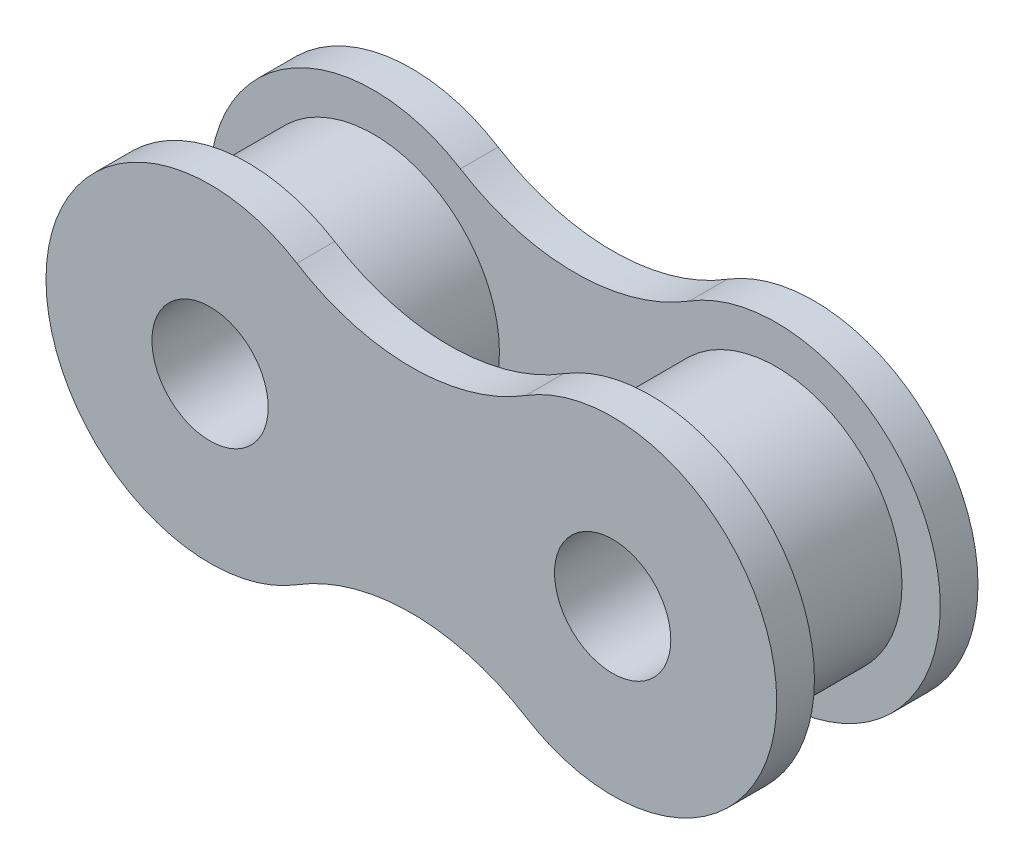
ISO-10303-21;
HEADER;
FILE_DESCRIPTION(('STEP AP214'),'2;1');
FILE_NAME('part.step','',(''),(''),'','','');
FILE_SCHEMA(('AUTOMOTIVE_DESIGN { 1 0 10303 214 1 1 1 1 }'));
ENDSEC;
DATA;
#1=APPLICATION_CONTEXT('core data for automotive mechanical design processes');
#2=APPLICATION_PROTOCOL_DEFINITION('international standard','automotive_design',2000,#1);
#3=PRODUCT_CONTEXT('',#1,'mechanical');
#4=PRODUCT('Part','Part','',(#3));
#5=PRODUCT_RELATED_PRODUCT_CATEGORY('part','',(#4));
#6=PRODUCT_DEFINITION_FORMATION('','',#4);
#7=PRODUCT_DEFINITION_CONTEXT('part definition',#1,'design');
#8=PRODUCT_DEFINITION('design','',#6,#7);
#9=PRODUCT_DEFINITION_SHAPE('','',#8);
#10=(LENGTH_UNIT() NAMED_UNIT(*) SI_UNIT(.MILLI.,.METRE.));
#11=(NAMED_UNIT(*) PLANE_ANGLE_UNIT() SI_UNIT($,.RADIAN.));
#12=(NAMED_UNIT(*) SI_UNIT($,.STERADIAN.) SOLID_ANGLE_UNIT());
#13=UNCERTAINTY_MEASURE_WITH_UNIT(LENGTH_MEASURE(1.E-05),#10,'distance_accuracy_value','');
#14=(GEOMETRIC_REPRESENTATION_CONTEXT(3) GLOBAL_UNCERTAINTY_ASSIGNED_CONTEXT((#13)) GLOBAL_UNIT_ASSIGNED_CONTEXT((#10,
#11,#12)) REPRESENTATION_CONTEXT('',''));
#15=CARTESIAN_POINT('',(0.,0.,0.));
#16=DIRECTION('',(0.,0.,1.));
#17=DIRECTION('',(1.,0.,0.));
#18=AXIS2_PLACEMENT_3D('',#15,#16,#17);
#19=CARTESIAN_POINT('',(-2.,-3.20755358489925,-4.));
#20=DIRECTION('',(0.,0.,1.));
#21=DIRECTION('',(1.,0.,0.));
#22=AXIS2_PLACEMENT_3D('',#19,#20,#21);
#23=PLANE('',#22);
#24=CARTESIAN_POINT('',(-4.,0.,-4.));
#25=DIRECTION('',(0.,0.,1.));
#26=DIRECTION('',(1.,0.,0.));
#27=AXIS2_PLACEMENT_3D('',#24,#25,#26);
#28=CIRCLE('',#27,3.26);
#29=CARTESIAN_POINT('',(-2.27513227513228,2.76630282718824,-4.));
#30=VERTEX_POINT('',#29);
#31=CARTESIAN_POINT('',(-2.27513227513227,-2.76630282718824,-4.));
#32=VERTEX_POINT('',#31);
#33=EDGE_CURVE('E173',#30,#32,#28,.T.);
#34=ORIENTED_EDGE('',*,*,#33,.T.);
#35=CARTESIAN_POINT('',(0.,-6.41510716979849,-4.));
#36=DIRECTION('',(0.,0.,-1.));
#37=DIRECTION('',(1.,0.,0.));
#38=AXIS2_PLACEMENT_3D('',#35,#36,#37);
#39=CIRCLE('',#38,4.3);
#40=CARTESIAN_POINT('',(2.27513227513228,-2.76630282718824,-4.));
#41=VERTEX_POINT('',#40);
#42=EDGE_CURVE('E85',#32,#41,#39,.T.);
#43=ORIENTED_EDGE('',*,*,#42,.T.);
#44=CARTESIAN_POINT('',(4.,0.,-4.));
#45=DIRECTION('',(0.,0.,1.));
#46=DIRECTION('',(1.,0.,0.));
#47=AXIS2_PLACEMENT_3D('',#44,#45,#46);
#48=CIRCLE('',#47,3.26);
#49=CARTESIAN_POINT('',(2.27513227513228,2.76630282718824,-4.));
#50=VERTEX_POINT('',#49);
#51=EDGE_CURVE('E176',#41,#50,#48,.T.);
#52=ORIENTED_EDGE('',*,*,#51,.T.);
#53=CARTESIAN_POINT('',(0.,6.41510716979849,-4.));
#54=DIRECTION('',(0.,0.,-1.));
#55=DIRECTION('',(1.,0.,0.));
#56=AXIS2_PLACEMENT_3D('',#53,#54,#55);
#57=CIRCLE('',#56,4.3);
#58=EDGE_CURVE('E53',#50,#30,#57,.T.);
#59=ORIENTED_EDGE('',*,*,#58,.T.);
#60=EDGE_LOOP('',(#34,#43,#52,#59));
#61=FACE_BOUND('',#60,.T.);
#62=CARTESIAN_POINT('',(-4.,0.,-4.));
#63=DIRECTION('',(0.,0.,1.));
#64=DIRECTION('',(1.,0.,0.));
#65=AXIS2_PLACEMENT_3D('',#62,#63,#64);
#66=CIRCLE('',#65,2.5);
#67=CARTESIAN_POINT('',(-6.5,0.,-4.));
#68=VERTEX_POINT('',#67);
#69=EDGE_CURVE('E11',#68,#68,#66,.T.);
#70=ORIENTED_EDGE('',*,*,#69,.F.);
#71=EDGE_LOOP('',(#70));
#72=FACE_BOUND('',#71,.T.);
#73=CARTESIAN_POINT('',(4.,0.,-4.));
#74=DIRECTION('',(0.,0.,1.));
#75=DIRECTION('',(1.,0.,0.));
#76=AXIS2_PLACEMENT_3D('',#73,#74,#75);
#77=CIRCLE('',#76,2.5);
#78=CARTESIAN_POINT('',(1.5,0.,-4.));
#79=VERTEX_POINT('',#78);
#80=EDGE_CURVE('E157',#79,#79,#77,.T.);
#81=ORIENTED_EDGE('',*,*,#80,.F.);
#82=EDGE_LOOP('',(#81));
#83=FACE_BOUND('',#82,.T.);
#84=ADVANCED_FACE('F34',(#61,#72,#83),#23,.T.);
#85=CARTESIAN_POINT('',(-2.,-3.20755358489925,-4.75));
#86=DIRECTION('',(0.,0.,1.));
#87=DIRECTION('',(1.,0.,0.));
#88=AXIS2_PLACEMENT_3D('',#85,#86,#87);
#89=PLANE('',#88);
#90=CARTESIAN_POINT('',(-4.,0.,-4.75));
#91=DIRECTION('',(0.,0.,1.));
#92=DIRECTION('',(1.,0.,0.));
#93=AXIS2_PLACEMENT_3D('',#90,#91,#92);
#94=CIRCLE('',#93,3.26);
#95=CARTESIAN_POINT('',(-2.27513227513228,2.76630282718824,-4.75));
#96=VERTEX_POINT('',#95);
#97=CARTESIAN_POINT('',(-2.27513227513227,-2.76630282718824,-4.75));
#98=VERTEX_POINT('',#97);
#99=EDGE_CURVE('E172',#96,#98,#94,.T.);
#100=ORIENTED_EDGE('',*,*,#99,.F.);
#101=CARTESIAN_POINT('',(0.,6.41510716979849,-4.75));
#102=DIRECTION('',(0.,0.,-1.));
#103=DIRECTION('',(1.,0.,0.));
#104=AXIS2_PLACEMENT_3D('',#101,#102,#103);
#105=CIRCLE('',#104,4.3);
#106=CARTESIAN_POINT('',(2.27513227513228,2.76630282718824,-4.75));
#107=VERTEX_POINT('',#106);
#108=EDGE_CURVE('E77',#107,#96,#105,.T.);
#109=ORIENTED_EDGE('',*,*,#108,.F.);
#110=CARTESIAN_POINT('',(4.,0.,-4.75));
#111=DIRECTION('',(0.,0.,1.));
#112=DIRECTION('',(1.,0.,0.));
#113=AXIS2_PLACEMENT_3D('',#110,#111,#112);
#114=CIRCLE('',#113,3.26);
#115=CARTESIAN_POINT('',(2.27513227513228,-2.76630282718824,-4.75));
#116=VERTEX_POINT('',#115);
#117=EDGE_CURVE('E71',#116,#107,#114,.T.);
#118=ORIENTED_EDGE('',*,*,#117,.F.);
#119=CARTESIAN_POINT('',(0.,-6.41510716979849,-4.75));
#120=DIRECTION('',(0.,0.,-1.));
#121=DIRECTION('',(1.,0.,0.));
#122=AXIS2_PLACEMENT_3D('',#119,#120,#121);
#123=CIRCLE('',#122,4.3);
#124=EDGE_CURVE('E182',#98,#116,#123,.T.);
#125=ORIENTED_EDGE('',*,*,#124,.F.);
#126=EDGE_LOOP('',(#100,#109,#118,#125));
#127=FACE_BOUND('',#126,.T.);
#128=CARTESIAN_POINT('',(-4.,0.,-4.75));
#129=DIRECTION('',(0.,0.,1.));
#130=DIRECTION('',(1.,0.,0.));
#131=AXIS2_PLACEMENT_3D('',#128,#129,#130);
#132=CIRCLE('',#131,1.155);
#133=CARTESIAN_POINT('',(-2.845,0.,-4.75));
#134=VERTEX_POINT('',#133);
#135=EDGE_CURVE('E169',#134,#134,#132,.T.);
#136=ORIENTED_EDGE('',*,*,#135,.T.);
#137=EDGE_LOOP('',(#136));
#138=FACE_BOUND('',#137,.T.);
#139=CARTESIAN_POINT('',(4.,0.,-4.75));
#140=DIRECTION('',(0.,0.,1.));
#141=DIRECTION('',(1.,0.,0.));
#142=AXIS2_PLACEMENT_3D('',#139,#140,#141);
#143=CIRCLE('',#142,1.155);
#144=CARTESIAN_POINT('',(5.155,0.,-4.75));
#145=VERTEX_POINT('',#144);
#146=EDGE_CURVE('E165',#145,#145,#143,.T.);
#147=ORIENTED_EDGE('',*,*,#146,.T.);
#148=EDGE_LOOP('',(#147));
#149=FACE_BOUND('',#148,.T.);
#150=ADVANCED_FACE('F196',(#127,#138,#149),#89,.F.);
#151=CARTESIAN_POINT('',(-4.,0.,-4.));
#152=DIRECTION('',(0.,0.,-1.));
#153=DIRECTION('',(-1.,0.,0.));
#154=AXIS2_PLACEMENT_3D('',#151,#152,#153);
#155=CYLINDRICAL_SURFACE('',#154,3.26);
#156=ORIENTED_EDGE('',*,*,#99,.T.);
#157=DIRECTION('',(0.,0.,-1.));
#158=VECTOR('',#157,1.);
#159=CARTESIAN_POINT('',(-2.27513227513227,-2.76630282718824,-4.));
#160=LINE('',#159,#158);
#161=EDGE_CURVE('E44',#32,#98,#160,.T.);
#162=ORIENTED_EDGE('',*,*,#161,.F.);
#163=ORIENTED_EDGE('',*,*,#33,.F.);
#164=DIRECTION('',(0.,0.,-1.));
#165=VECTOR('',#164,1.);
#166=CARTESIAN_POINT('',(-2.27513227513228,2.76630282718824,-4.));
#167=LINE('',#166,#165);
#168=EDGE_CURVE('E179',#30,#96,#167,.T.);
#169=ORIENTED_EDGE('',*,*,#168,.T.);
#170=EDGE_LOOP('',(#156,#162,#163,#169));
#171=FACE_BOUND('',#170,.T.);
#172=ADVANCED_FACE('F36',(#171),#155,.T.);
#173=CARTESIAN_POINT('',(0.,-6.41510716979849,-4.));
#174=DIRECTION('',(0.,0.,-1.));
#175=DIRECTION('',(-1.,0.,0.));
#176=AXIS2_PLACEMENT_3D('',#173,#174,#175);
#177=CYLINDRICAL_SURFACE('',#176,4.3);
#178=ORIENTED_EDGE('',*,*,#124,.T.);
#179=DIRECTION('',(0.,0.,-1.));
#180=VECTOR('',#179,1.);
#181=CARTESIAN_POINT('',(2.27513227513228,-2.76630282718824,-4.));
#182=LINE('',#181,#180);
#183=EDGE_CURVE('E189',#41,#116,#182,.T.);
#184=ORIENTED_EDGE('',*,*,#183,.F.);
#185=ORIENTED_EDGE('',*,*,#42,.F.);
#186=ORIENTED_EDGE('',*,*,#161,.T.);
#187=EDGE_LOOP('',(#178,#184,#185,#186));
#188=FACE_BOUND('',#187,.T.);
#189=ADVANCED_FACE('F191',(#188),#177,.F.);
#190=CARTESIAN_POINT('',(4.,0.,-4.));
#191=DIRECTION('',(0.,0.,-1.));
#192=DIRECTION('',(-1.,0.,0.));
#193=AXIS2_PLACEMENT_3D('',#190,#191,#192);
#194=CYLINDRICAL_SURFACE('',#193,3.26);
#195=ORIENTED_EDGE('',*,*,#117,.T.);
#196=DIRECTION('',(0.,0.,-1.));
#197=VECTOR('',#196,1.);
#198=CARTESIAN_POINT('',(2.27513227513228,2.76630282718824,-4.));
#199=LINE('',#198,#197);
#200=EDGE_CURVE('E187',#50,#107,#199,.T.);
#201=ORIENTED_EDGE('',*,*,#200,.F.);
#202=ORIENTED_EDGE('',*,*,#51,.F.);
#203=ORIENTED_EDGE('',*,*,#183,.T.);
#204=EDGE_LOOP('',(#195,#201,#202,#203));
#205=FACE_BOUND('',#204,.T.);
#206=ADVANCED_FACE('F242',(#205),#194,.T.);
#207=CARTESIAN_POINT('',(0.,6.41510716979849,-4.));
#208=DIRECTION('',(0.,0.,-1.));
#209=DIRECTION('',(-1.,0.,0.));
#210=AXIS2_PLACEMENT_3D('',#207,#208,#209);
#211=CYLINDRICAL_SURFACE('',#210,4.3);
#212=ORIENTED_EDGE('',*,*,#108,.T.);
#213=ORIENTED_EDGE('',*,*,#168,.F.);
#214=ORIENTED_EDGE('',*,*,#58,.F.);
#215=ORIENTED_EDGE('',*,*,#200,.T.);
#216=EDGE_LOOP('',(#212,#213,#214,#215));
#217=FACE_BOUND('',#216,.T.);
#218=ADVANCED_FACE('F239',(#217),#211,.F.);
#219=CARTESIAN_POINT('',(-4.,0.,-4.));
#220=DIRECTION('',(0.,0.,-1.));
#221=DIRECTION('',(-1.,0.,0.));
#222=AXIS2_PLACEMENT_3D('',#219,#220,#221);
#223=CYLINDRICAL_SURFACE('',#222,1.155);
#224=ORIENTED_EDGE('',*,*,#135,.F.);
#225=EDGE_LOOP('',(#224));
#226=FACE_BOUND('',#225,.T.);
#227=CARTESIAN_POINT('',(-4.,0.,-0.75));
#228=DIRECTION('',(0.,0.,1.));
#229=DIRECTION('',(1.,0.,0.));
#230=AXIS2_PLACEMENT_3D('',#227,#228,#229);
#231=CIRCLE('',#230,1.155);
#232=CARTESIAN_POINT('',(-2.845,0.,-0.75));
#233=VERTEX_POINT('',#232);
#234=EDGE_CURVE('E161',#233,#233,#231,.F.);
#235=ORIENTED_EDGE('',*,*,#234,.F.);
#236=EDGE_LOOP('',(#235));
#237=FACE_BOUND('',#236,.T.);
#238=ADVANCED_FACE('F208',(#226,#237),#223,.F.);
#239=CARTESIAN_POINT('',(4.,0.,-4.));
#240=DIRECTION('',(0.,0.,-1.));
#241=DIRECTION('',(-1.,0.,0.));
#242=AXIS2_PLACEMENT_3D('',#239,#240,#241);
#243=CYLINDRICAL_SURFACE('',#242,1.155);
#244=ORIENTED_EDGE('',*,*,#146,.F.);
#245=EDGE_LOOP('',(#244));
#246=FACE_BOUND('',#245,.T.);
#247=CARTESIAN_POINT('',(4.,0.,-0.75));
#248=DIRECTION('',(0.,0.,1.));
#249=DIRECTION('',(1.,0.,0.));
#250=AXIS2_PLACEMENT_3D('',#247,#248,#249);
#251=CIRCLE('',#250,1.155);
#252=CARTESIAN_POINT('',(5.155,0.,-0.75));
#253=VERTEX_POINT('',#252);
#254=EDGE_CURVE('E158',#253,#253,#251,.F.);
#255=ORIENTED_EDGE('',*,*,#254,.F.);
#256=EDGE_LOOP('',(#255));
#257=FACE_BOUND('',#256,.T.);
#258=ADVANCED_FACE('F204',(#246,#257),#243,.F.);
#259=CARTESIAN_POINT('',(-4.,0.,6.32106781186548));
#260=DIRECTION('',(0.,0.,-1.));
#261=DIRECTION('',(-1.,0.,0.));
#262=AXIS2_PLACEMENT_3D('',#259,#260,#261);
#263=CYLINDRICAL_SURFACE('',#262,2.5);
#264=CARTESIAN_POINT('',(-4.,0.,-1.5));
#265=DIRECTION('',(0.,0.,-1.));
#266=DIRECTION('',(-1.,0.,0.));
#267=AXIS2_PLACEMENT_3D('',#264,#265,#266);
#268=CIRCLE('',#267,2.5);
#269=CARTESIAN_POINT('',(-6.5,0.,-1.5));
#270=VERTEX_POINT('',#269);
#271=EDGE_CURVE('E154',#270,#270,#268,.T.);
#272=CARTESIAN_POINT('',(-6.5,0.,-1.5));
#273=CARTESIAN_POINT('',(-6.5,0.,-1.52604166666667));
#274=CARTESIAN_POINT('',(-6.5,0.,-1.55208333333333));
#275=CARTESIAN_POINT('',(-6.5,0.,-1.60416666666667));
#276=CARTESIAN_POINT('',(-6.5,0.,-1.63020833333333));
#277=CARTESIAN_POINT('',(-6.5,0.,-1.68229166666667));
#278=CARTESIAN_POINT('',(-6.5,0.,-1.70833333333333));
#279=CARTESIAN_POINT('',(-6.5,0.,-1.76041666666667));
#280=CARTESIAN_POINT('',(-6.5,0.,-1.78645833333333));
#281=CARTESIAN_POINT('',(-6.5,0.,-1.83854166666667));
#282=CARTESIAN_POINT('',(-6.5,0.,-1.86458333333333));
#283=CARTESIAN_POINT('',(-6.5,0.,-1.91666666666667));
#284=CARTESIAN_POINT('',(-6.5,0.,-1.94270833333333));
#285=CARTESIAN_POINT('',(-6.5,0.,-1.99479166666667));
#286=CARTESIAN_POINT('',(-6.5,0.,-2.02083333333333));
#287=CARTESIAN_POINT('',(-6.5,0.,-2.07291666666667));
#288=CARTESIAN_POINT('',(-6.5,0.,-2.09895833333333));
#289=CARTESIAN_POINT('',(-6.5,0.,-2.15104166666667));
#290=CARTESIAN_POINT('',(-6.5,0.,-2.17708333333333));
#291=CARTESIAN_POINT('',(-6.5,0.,-2.22916666666667));
#292=CARTESIAN_POINT('',(-6.5,0.,-2.25520833333333));
#293=CARTESIAN_POINT('',(-6.5,0.,-2.30729166666667));
#294=CARTESIAN_POINT('',(-6.5,0.,-2.33333333333333));
#295=CARTESIAN_POINT('',(-6.5,0.,-2.38541666666667));
#296=CARTESIAN_POINT('',(-6.5,0.,-2.41145833333333));
#297=CARTESIAN_POINT('',(-6.5,0.,-2.46354166666667));
#298=CARTESIAN_POINT('',(-6.5,0.,-2.48958333333333));
#299=CARTESIAN_POINT('',(-6.5,0.,-2.54166666666667));
#300=CARTESIAN_POINT('',(-6.5,0.,-2.56770833333333));
#301=CARTESIAN_POINT('',(-6.5,0.,-2.61979166666667));
#302=CARTESIAN_POINT('',(-6.5,0.,-2.64583333333333));
#303=CARTESIAN_POINT('',(-6.5,0.,-2.69791666666667));
#304=CARTESIAN_POINT('',(-6.5,0.,-2.72395833333333));
#305=CARTESIAN_POINT('',(-6.5,0.,-2.77604166666667));
#306=CARTESIAN_POINT('',(-6.5,0.,-2.80208333333333));
#307=CARTESIAN_POINT('',(-6.5,0.,-2.85416666666667));
#308=CARTESIAN_POINT('',(-6.5,0.,-2.88020833333333));
#309=CARTESIAN_POINT('',(-6.5,0.,-2.93229166666667));
#310=CARTESIAN_POINT('',(-6.5,0.,-2.95833333333333));
#311=CARTESIAN_POINT('',(-6.5,0.,-3.01041666666667));
#312=CARTESIAN_POINT('',(-6.5,0.,-3.03645833333333));
#313=CARTESIAN_POINT('',(-6.5,0.,-3.08854166666667));
#314=CARTESIAN_POINT('',(-6.5,0.,-3.11458333333333));
#315=CARTESIAN_POINT('',(-6.5,0.,-3.16666666666667));
#316=CARTESIAN_POINT('',(-6.5,0.,-3.19270833333333));
#317=CARTESIAN_POINT('',(-6.5,0.,-3.24479166666667));
#318=CARTESIAN_POINT('',(-6.5,0.,-3.27083333333333));
#319=CARTESIAN_POINT('',(-6.5,0.,-3.32291666666667));
#320=CARTESIAN_POINT('',(-6.5,0.,-3.34895833333333));
#321=CARTESIAN_POINT('',(-6.5,0.,-3.40104166666667));
#322=CARTESIAN_POINT('',(-6.5,0.,-3.42708333333333));
#323=CARTESIAN_POINT('',(-6.5,0.,-3.47916666666667));
#324=CARTESIAN_POINT('',(-6.5,0.,-3.50520833333333));
#325=CARTESIAN_POINT('',(-6.5,0.,-3.55729166666667));
#326=CARTESIAN_POINT('',(-6.5,0.,-3.58333333333333));
#327=CARTESIAN_POINT('',(-6.5,0.,-3.63541666666667));
#328=CARTESIAN_POINT('',(-6.5,0.,-3.66145833333333));
#329=CARTESIAN_POINT('',(-6.5,0.,-3.71354166666667));
#330=CARTESIAN_POINT('',(-6.5,0.,-3.73958333333333));
#331=CARTESIAN_POINT('',(-6.5,0.,-3.79166666666667));
#332=CARTESIAN_POINT('',(-6.5,0.,-3.81770833333333));
#333=CARTESIAN_POINT('',(-6.5,0.,-3.86979166666667));
#334=CARTESIAN_POINT('',(-6.5,0.,-3.89583333333333));
#335=CARTESIAN_POINT('',(-6.5,0.,-3.94791666666667));
#336=CARTESIAN_POINT('',(-6.5,0.,-3.97395833333334));
#337=CARTESIAN_POINT('',(-6.5,0.,-4.));
#338=B_SPLINE_CURVE_WITH_KNOTS('',3,(#272,#273,#274,#275,#276,#277,#278,#279,#280,#281,#282,
#283,#284,#285,#286,#287,#288,#289,#290,#291,#292,#293,#294,#295,#296,#297,#298,#299,#300,#301,
#302,#303,#304,#305,#306,#307,#308,#309,#310,#311,#312,#313,#314,#315,#316,#317,#318,#319,#320,
#321,#322,#323,#324,#325,#326,#327,#328,#329,#330,#331,#332,#333,#334,#335,#336,#337),
.UNSPECIFIED.,.F.,.F.,(4,2,2,2,2,2,2,2,2,2,2,2,2,2,2,2,2,2,2,2,2,2,2,2,2,2,2,2,2,2,2,2,4),(0.,
0.0781250000000001,0.15625,0.234375,0.3125,0.390625,0.46875,0.546875,0.625000000000001,
0.703125000000001,0.781250000000001,0.859375000000001,0.937500000000001,1.015625,1.09375,
1.171875,1.25,1.328125,1.40625,1.484375,1.5625,1.640625,1.71875,1.796875,1.875,1.953125,2.03125,
2.109375,2.1875,2.265625,2.34375,2.421875,2.5),.UNSPECIFIED.);
#339=EDGE_CURVE('BSEAM207',#270,#68,#338,.T.);
#340=ORIENTED_EDGE('',*,*,#271,.T.);
#341=ORIENTED_EDGE('',*,*,#69,.T.);
#342=ORIENTED_EDGE('',*,*,#339,.T.);
#343=ORIENTED_EDGE('',*,*,#339,.F.);
#344=EDGE_LOOP('',(#340,#342,#341,#343));
#345=FACE_BOUND('',#344,.T.);
#346=ADVANCED_FACE('F207',(#345),#263,.T.);
#347=CARTESIAN_POINT('',(-2.,3.20755358489925,-0.75));
#348=DIRECTION('',(0.,0.,1.));
#349=DIRECTION('',(-1.,0.,0.));
#350=AXIS2_PLACEMENT_3D('',#347,#348,#349);
#351=PLANE('',#350);
#352=ORIENTED_EDGE('',*,*,#234,.T.);
#353=EDGE_LOOP('',(#352));
#354=FACE_BOUND('',#353,.T.);
#355=ORIENTED_EDGE('',*,*,#254,.T.);
#356=EDGE_LOOP('',(#355));
#357=FACE_BOUND('',#356,.T.);
#358=CARTESIAN_POINT('',(-4.,0.,-0.75));
#359=DIRECTION('',(0.,0.,1.));
#360=DIRECTION('',(1.,0.,0.));
#361=AXIS2_PLACEMENT_3D('',#358,#359,#360);
#362=CIRCLE('',#361,3.26);
#363=CARTESIAN_POINT('',(-2.27513227513228,2.76630282718824,-0.75));
#364=VERTEX_POINT('',#363);
#365=CARTESIAN_POINT('',(-2.27513227513227,-2.76630282718824,-0.75));
#366=VERTEX_POINT('',#365);
#367=EDGE_CURVE('E118',#364,#366,#362,.T.);
#368=ORIENTED_EDGE('',*,*,#367,.T.);
#369=CARTESIAN_POINT('',(0.,-6.41510716979849,-0.75));
#370=DIRECTION('',(0.,0.,-1.));
#371=DIRECTION('',(1.,0.,0.));
#372=AXIS2_PLACEMENT_3D('',#369,#370,#371);
#373=CIRCLE('',#372,4.3);
#374=CARTESIAN_POINT('',(2.27513227513228,-2.76630282718824,-0.75));
#375=VERTEX_POINT('',#374);
#376=EDGE_CURVE('E133',#366,#375,#373,.T.);
#377=ORIENTED_EDGE('',*,*,#376,.T.);
#378=CARTESIAN_POINT('',(4.,0.,-0.75));
#379=DIRECTION('',(0.,0.,1.));
#380=DIRECTION('',(1.,0.,0.));
#381=AXIS2_PLACEMENT_3D('',#378,#379,#380);
#382=CIRCLE('',#381,3.26);
#383=CARTESIAN_POINT('',(2.27513227513228,2.76630282718824,-0.75));
#384=VERTEX_POINT('',#383);
#385=EDGE_CURVE('E145',#375,#384,#382,.T.);
#386=ORIENTED_EDGE('',*,*,#385,.T.);
#387=CARTESIAN_POINT('',(0.,6.41510716979849,-0.75));
#388=DIRECTION('',(0.,0.,-1.));
#389=DIRECTION('',(1.,0.,0.));
#390=AXIS2_PLACEMENT_3D('',#387,#388,#389);
#391=CIRCLE('',#390,4.3);
#392=EDGE_CURVE('E143',#384,#364,#391,.T.);
#393=ORIENTED_EDGE('',*,*,#392,.T.);
#394=EDGE_LOOP('',(#368,#377,#386,#393));
#395=FACE_BOUND('',#394,.T.);
#396=ADVANCED_FACE('F212',(#354,#357,#395),#351,.T.);
#397=CARTESIAN_POINT('',(4.,0.,6.32106781186548));
#398=DIRECTION('',(0.,0.,-1.));
#399=DIRECTION('',(-1.,0.,0.));
#400=AXIS2_PLACEMENT_3D('',#397,#398,#399);
#401=CYLINDRICAL_SURFACE('',#400,2.5);
#402=CARTESIAN_POINT('',(4.,0.,-1.5));
#403=DIRECTION('',(0.,0.,-1.));
#404=DIRECTION('',(-1.,0.,0.));
#405=AXIS2_PLACEMENT_3D('',#402,#403,#404);
#406=CIRCLE('',#405,2.5);
#407=CARTESIAN_POINT('',(1.5,0.,-1.5));
#408=VERTEX_POINT('',#407);
#409=EDGE_CURVE('E38',#408,#408,#406,.T.);
#410=CARTESIAN_POINT('',(1.5,0.,-1.5));
#411=CARTESIAN_POINT('',(1.5,0.,-1.52604166666667));
#412=CARTESIAN_POINT('',(1.5,0.,-1.55208333333333));
#413=CARTESIAN_POINT('',(1.5,0.,-1.60416666666667));
#414=CARTESIAN_POINT('',(1.5,0.,-1.63020833333333));
#415=CARTESIAN_POINT('',(1.5,0.,-1.68229166666667));
#416=CARTESIAN_POINT('',(1.5,0.,-1.70833333333333));
#417=CARTESIAN_POINT('',(1.5,0.,-1.76041666666667));
#418=CARTESIAN_POINT('',(1.5,0.,-1.78645833333333));
#419=CARTESIAN_POINT('',(1.5,0.,-1.83854166666667));
#420=CARTESIAN_POINT('',(1.5,0.,-1.86458333333333));
#421=CARTESIAN_POINT('',(1.5,0.,-1.91666666666667));
#422=CARTESIAN_POINT('',(1.5,0.,-1.94270833333333));
#423=CARTESIAN_POINT('',(1.5,0.,-1.99479166666667));
#424=CARTESIAN_POINT('',(1.5,0.,-2.02083333333333));
#425=CARTESIAN_POINT('',(1.5,0.,-2.07291666666667));
#426=CARTESIAN_POINT('',(1.5,0.,-2.09895833333333));
#427=CARTESIAN_POINT('',(1.5,0.,-2.15104166666667));
#428=CARTESIAN_POINT('',(1.5,0.,-2.17708333333333));
#429=CARTESIAN_POINT('',(1.5,0.,-2.22916666666667));
#430=CARTESIAN_POINT('',(1.5,0.,-2.25520833333333));
#431=CARTESIAN_POINT('',(1.5,0.,-2.30729166666667));
#432=CARTESIAN_POINT('',(1.5,0.,-2.33333333333333));
#433=CARTESIAN_POINT('',(1.5,0.,-2.38541666666667));
#434=CARTESIAN_POINT('',(1.5,0.,-2.41145833333333));
#435=CARTESIAN_POINT('',(1.5,0.,-2.46354166666667));
#436=CARTESIAN_POINT('',(1.5,0.,-2.48958333333333));
#437=CARTESIAN_POINT('',(1.5,0.,-2.54166666666667));
#438=CARTESIAN_POINT('',(1.5,0.,-2.56770833333333));
#439=CARTESIAN_POINT('',(1.5,0.,-2.61979166666667));
#440=CARTESIAN_POINT('',(1.5,0.,-2.64583333333333));
#441=CARTESIAN_POINT('',(1.5,0.,-2.69791666666667));
#442=CARTESIAN_POINT('',(1.5,0.,-2.72395833333333));
#443=CARTESIAN_POINT('',(1.5,0.,-2.77604166666667));
#444=CARTESIAN_POINT('',(1.5,0.,-2.80208333333333));
#445=CARTESIAN_POINT('',(1.5,0.,-2.85416666666667));
#446=CARTESIAN_POINT('',(1.5,0.,-2.88020833333333));
#447=CARTESIAN_POINT('',(1.5,0.,-2.93229166666667));
#448=CARTESIAN_POINT('',(1.5,0.,-2.95833333333333));
#449=CARTESIAN_POINT('',(1.5,0.,-3.01041666666667));
#450=CARTESIAN_POINT('',(1.5,0.,-3.03645833333333));
#451=CARTESIAN_POINT('',(1.5,0.,-3.08854166666667));
#452=CARTESIAN_POINT('',(1.5,0.,-3.11458333333333));
#453=CARTESIAN_POINT('',(1.5,0.,-3.16666666666667));
#454=CARTESIAN_POINT('',(1.5,0.,-3.19270833333333));
#455=CARTESIAN_POINT('',(1.5,0.,-3.24479166666667));
#456=CARTESIAN_POINT('',(1.5,0.,-3.27083333333333));
#457=CARTESIAN_POINT('',(1.5,0.,-3.32291666666667));
#458=CARTESIAN_POINT('',(1.5,0.,-3.34895833333333));
#459=CARTESIAN_POINT('',(1.5,0.,-3.40104166666667));
#460=CARTESIAN_POINT('',(1.5,0.,-3.42708333333333));
#461=CARTESIAN_POINT('',(1.5,0.,-3.47916666666667));
#462=CARTESIAN_POINT('',(1.5,0.,-3.50520833333333));
#463=CARTESIAN_POINT('',(1.5,0.,-3.55729166666667));
#464=CARTESIAN_POINT('',(1.5,0.,-3.58333333333333));
#465=CARTESIAN_POINT('',(1.5,0.,-3.63541666666667));
#466=CARTESIAN_POINT('',(1.5,0.,-3.66145833333333));
#467=CARTESIAN_POINT('',(1.5,0.,-3.71354166666667));
#468=CARTESIAN_POINT('',(1.5,0.,-3.73958333333333));
#469=CARTESIAN_POINT('',(1.5,0.,-3.79166666666667));
#470=CARTESIAN_POINT('',(1.5,0.,-3.81770833333333));
#471=CARTESIAN_POINT('',(1.5,0.,-3.86979166666667));
#472=CARTESIAN_POINT('',(1.5,0.,-3.89583333333333));
#473=CARTESIAN_POINT('',(1.5,0.,-3.94791666666667));
#474=CARTESIAN_POINT('',(1.5,0.,-3.97395833333334));
#475=CARTESIAN_POINT('',(1.5,0.,-4.));
#476=B_SPLINE_CURVE_WITH_KNOTS('',3,(#410,#411,#412,#413,#414,#415,#416,#417,#418,#419,#420,
#421,#422,#423,#424,#425,#426,#427,#428,#429,#430,#431,#432,#433,#434,#435,#436,#437,#438,#439,
#440,#441,#442,#443,#444,#445,#446,#447,#448,#449,#450,#451,#452,#453,#454,#455,#456,#457,#458,
#459,#460,#461,#462,#463,#464,#465,#466,#467,#468,#469,#470,#471,#472,#473,#474,#475),
.UNSPECIFIED.,.F.,.F.,(4,2,2,2,2,2,2,2,2,2,2,2,2,2,2,2,2,2,2,2,2,2,2,2,2,2,2,2,2,2,2,2,4),(0.,
0.0781250000000001,0.15625,0.234375,0.3125,0.390625,0.46875,0.546875,0.625000000000001,
0.703125000000001,0.781250000000001,0.859375000000001,0.937500000000001,1.015625,1.09375,
1.171875,1.25,1.328125,1.40625,1.484375,1.5625,1.640625,1.71875,1.796875,1.875,1.953125,2.03125,
2.109375,2.1875,2.265625,2.34375,2.421875,2.5),.UNSPECIFIED.);
#477=EDGE_CURVE('BSEAM215',#408,#79,#476,.T.);
#478=ORIENTED_EDGE('',*,*,#409,.T.);
#479=ORIENTED_EDGE('',*,*,#80,.T.);
#480=ORIENTED_EDGE('',*,*,#477,.T.);
#481=ORIENTED_EDGE('',*,*,#477,.F.);
#482=EDGE_LOOP('',(#478,#480,#479,#481));
#483=FACE_BOUND('',#482,.T.);
#484=ADVANCED_FACE('F215',(#483),#401,.T.);
#485=CARTESIAN_POINT('',(-4.,0.,-1.5));
#486=DIRECTION('',(0.,0.,1.));
#487=DIRECTION('',(1.,0.,0.));
#488=AXIS2_PLACEMENT_3D('',#485,#486,#487);
#489=CYLINDRICAL_SURFACE('',#488,3.26);
#490=ORIENTED_EDGE('',*,*,#367,.F.);
#491=DIRECTION('',(0.,0.,1.));
#492=VECTOR('',#491,1.);
#493=CARTESIAN_POINT('',(-2.27513227513228,2.76630282718824,-1.5));
#494=LINE('',#493,#492);
#495=CARTESIAN_POINT('',(-2.27513227513228,2.76630282718824,-1.5));
#496=VERTEX_POINT('',#495);
#497=EDGE_CURVE('E112',#496,#364,#494,.T.);
#498=ORIENTED_EDGE('',*,*,#497,.F.);
#499=CARTESIAN_POINT('',(-4.,0.,-1.5));
#500=DIRECTION('',(0.,0.,1.));
#501=DIRECTION('',(1.,0.,0.));
#502=AXIS2_PLACEMENT_3D('',#499,#500,#501);
#503=CIRCLE('',#502,3.26);
#504=CARTESIAN_POINT('',(-2.27513227513227,-2.76630282718824,-1.5));
#505=VERTEX_POINT('',#504);
#506=EDGE_CURVE('E115',#496,#505,#503,.T.);
#507=ORIENTED_EDGE('',*,*,#506,.T.);
#508=DIRECTION('',(0.,0.,1.));
#509=VECTOR('',#508,1.);
#510=CARTESIAN_POINT('',(-2.27513227513227,-2.76630282718824,-1.5));
#511=LINE('',#510,#509);
#512=EDGE_CURVE('E141',#505,#366,#511,.T.);
#513=ORIENTED_EDGE('',*,*,#512,.T.);
#514=EDGE_LOOP('',(#490,#498,#507,#513));
#515=FACE_BOUND('',#514,.T.);
#516=ADVANCED_FACE('F114',(#515),#489,.T.);
#517=CARTESIAN_POINT('',(0.,6.41510716979849,-1.5));
#518=DIRECTION('',(0.,0.,1.));
#519=DIRECTION('',(1.,0.,0.));
#520=AXIS2_PLACEMENT_3D('',#517,#518,#519);
#521=CYLINDRICAL_SURFACE('',#520,4.3);
#522=ORIENTED_EDGE('',*,*,#392,.F.);
#523=DIRECTION('',(0.,0.,1.));
#524=VECTOR('',#523,1.);
#525=CARTESIAN_POINT('',(2.27513227513228,2.76630282718824,-1.5));
#526=LINE('',#525,#524);
#527=CARTESIAN_POINT('',(2.27513227513228,2.76630282718824,-1.5));
#528=VERTEX_POINT('',#527);
#529=EDGE_CURVE('E123',#528,#384,#526,.T.);
#530=ORIENTED_EDGE('',*,*,#529,.F.);
#531=CARTESIAN_POINT('',(0.,6.41510716979849,-1.5));
#532=DIRECTION('',(0.,0.,-1.));
#533=DIRECTION('',(1.,0.,0.));
#534=AXIS2_PLACEMENT_3D('',#531,#532,#533);
#535=CIRCLE('',#534,4.3);
#536=EDGE_CURVE('E129',#528,#496,#535,.T.);
#537=ORIENTED_EDGE('',*,*,#536,.T.);
#538=ORIENTED_EDGE('',*,*,#497,.T.);
#539=EDGE_LOOP('',(#522,#530,#537,#538));
#540=FACE_BOUND('',#539,.T.);
#541=ADVANCED_FACE('F135',(#540),#521,.F.);
#542=CARTESIAN_POINT('',(4.,0.,-1.5));
#543=DIRECTION('',(0.,0.,1.));
#544=DIRECTION('',(1.,0.,0.));
#545=AXIS2_PLACEMENT_3D('',#542,#543,#544);
#546=CYLINDRICAL_SURFACE('',#545,3.26);
#547=ORIENTED_EDGE('',*,*,#385,.F.);
#548=DIRECTION('',(0.,0.,1.));
#549=VECTOR('',#548,1.);
#550=CARTESIAN_POINT('',(2.27513227513228,-2.76630282718824,-1.5));
#551=LINE('',#550,#549);
#552=CARTESIAN_POINT('',(2.27513227513228,-2.76630282718824,-1.5));
#553=VERTEX_POINT('',#552);
#554=EDGE_CURVE('E151',#553,#375,#551,.T.);
#555=ORIENTED_EDGE('',*,*,#554,.F.);
#556=CARTESIAN_POINT('',(4.,0.,-1.5));
#557=DIRECTION('',(0.,0.,1.));
#558=DIRECTION('',(1.,0.,0.));
#559=AXIS2_PLACEMENT_3D('',#556,#557,#558);
#560=CIRCLE('',#559,3.26);
#561=EDGE_CURVE('E136',#553,#528,#560,.T.);
#562=ORIENTED_EDGE('',*,*,#561,.T.);
#563=ORIENTED_EDGE('',*,*,#529,.T.);
#564=EDGE_LOOP('',(#547,#555,#562,#563));
#565=FACE_BOUND('',#564,.T.);
#566=ADVANCED_FACE('F223',(#565),#546,.T.);
#567=CARTESIAN_POINT('',(0.,-6.41510716979849,-1.5));
#568=DIRECTION('',(0.,0.,1.));
#569=DIRECTION('',(1.,0.,0.));
#570=AXIS2_PLACEMENT_3D('',#567,#568,#569);
#571=CYLINDRICAL_SURFACE('',#570,4.3);
#572=ORIENTED_EDGE('',*,*,#376,.F.);
#573=ORIENTED_EDGE('',*,*,#512,.F.);
#574=CARTESIAN_POINT('',(0.,-6.41510716979849,-1.5));
#575=DIRECTION('',(0.,0.,-1.));
#576=DIRECTION('',(1.,0.,0.));
#577=AXIS2_PLACEMENT_3D('',#574,#575,#576);
#578=CIRCLE('',#577,4.3);
#579=EDGE_CURVE('E132',#505,#553,#578,.T.);
#580=ORIENTED_EDGE('',*,*,#579,.T.);
#581=ORIENTED_EDGE('',*,*,#554,.T.);
#582=EDGE_LOOP('',(#572,#573,#580,#581));
#583=FACE_BOUND('',#582,.T.);
#584=ADVANCED_FACE('F220',(#583),#571,.F.);
#585=CARTESIAN_POINT('',(-2.,-3.20755358489925,-1.5));
#586=DIRECTION('',(0.,0.,-1.));
#587=DIRECTION('',(1.,0.,0.));
#588=AXIS2_PLACEMENT_3D('',#585,#586,#587);
#589=PLANE('',#588);
#590=ORIENTED_EDGE('',*,*,#271,.F.);
#591=EDGE_LOOP('',(#590));
#592=FACE_BOUND('',#591,.T.);
#593=ORIENTED_EDGE('',*,*,#409,.F.);
#594=EDGE_LOOP('',(#593));
#595=FACE_BOUND('',#594,.T.);
#596=ORIENTED_EDGE('',*,*,#506,.F.);
#597=ORIENTED_EDGE('',*,*,#536,.F.);
#598=ORIENTED_EDGE('',*,*,#561,.F.);
#599=ORIENTED_EDGE('',*,*,#579,.F.);
#600=EDGE_LOOP('',(#596,#597,#598,#599));
#601=FACE_BOUND('',#600,.T.);
#602=ADVANCED_FACE('F127',(#592,#595,#601),#589,.T.);
#603=CLOSED_SHELL('',(#84,#150,#172,#189,#206,#218,#238,#258,#346,#396,#484,#516,#541,#566,#584,#602));
#604=MANIFOLD_SOLID_BREP('B2',#603);
#605=ADVANCED_BREP_SHAPE_REPRESENTATION('',(#18,#604),#14);
#606=SHAPE_DEFINITION_REPRESENTATION(#9,#605);
ENDSEC;
END-ISO-10303-21;
